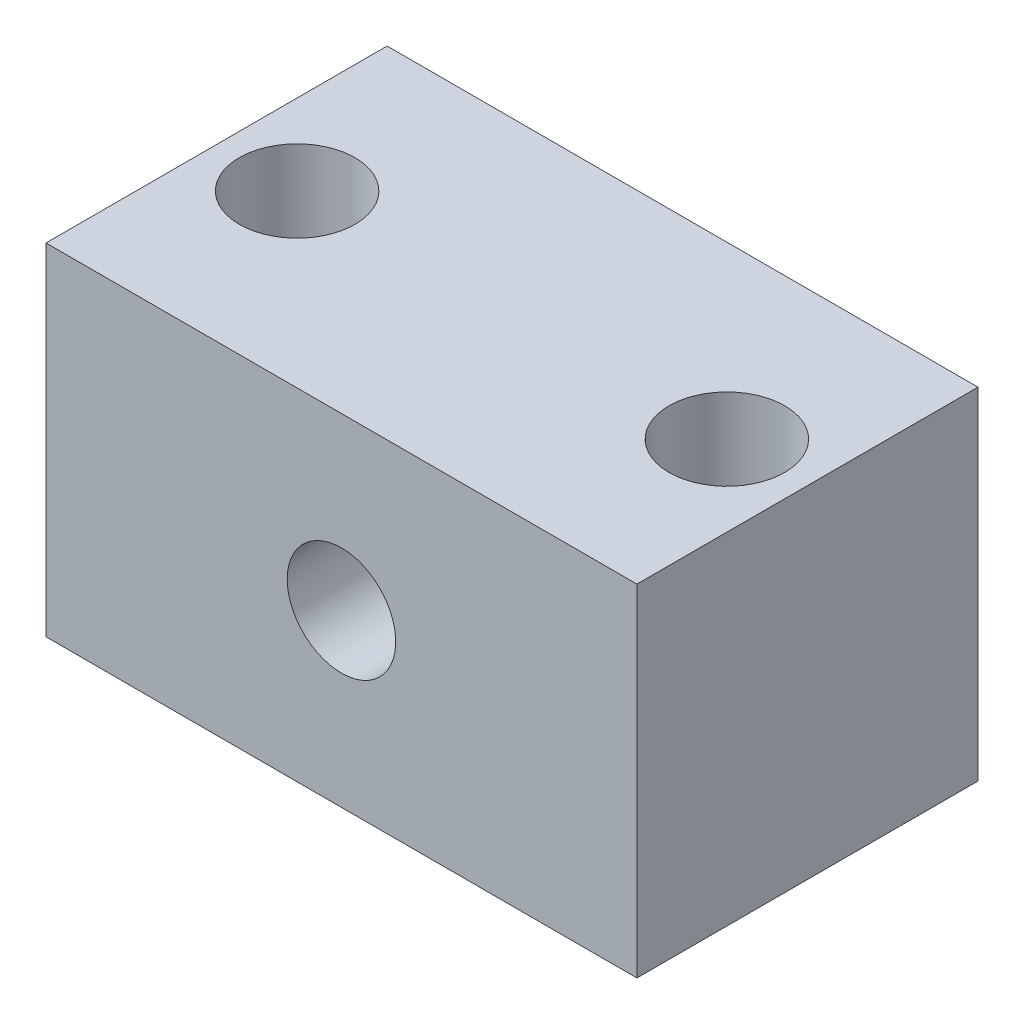
ISO-10303-21;
HEADER;
FILE_DESCRIPTION(('STEP AP214'),'2;1');
FILE_NAME('part.step','',(''),(''),'','','');
FILE_SCHEMA(('AUTOMOTIVE_DESIGN { 1 0 10303 214 1 1 1 1 }'));
ENDSEC;
DATA;
#1=APPLICATION_CONTEXT('core data for automotive mechanical design processes');
#2=APPLICATION_PROTOCOL_DEFINITION('international standard','automotive_design',2000,#1);
#3=PRODUCT_CONTEXT('',#1,'mechanical');
#4=PRODUCT('Part','Part','',(#3));
#5=PRODUCT_RELATED_PRODUCT_CATEGORY('part','',(#4));
#6=PRODUCT_DEFINITION_FORMATION('','',#4);
#7=PRODUCT_DEFINITION_CONTEXT('part definition',#1,'design');
#8=PRODUCT_DEFINITION('design','',#6,#7);
#9=PRODUCT_DEFINITION_SHAPE('','',#8);
#10=(LENGTH_UNIT() NAMED_UNIT(*) SI_UNIT(.MILLI.,.METRE.));
#11=(NAMED_UNIT(*) PLANE_ANGLE_UNIT() SI_UNIT($,.RADIAN.));
#12=(NAMED_UNIT(*) SI_UNIT($,.STERADIAN.) SOLID_ANGLE_UNIT());
#13=UNCERTAINTY_MEASURE_WITH_UNIT(LENGTH_MEASURE(1.E-05),#10,'distance_accuracy_value','');
#14=(GEOMETRIC_REPRESENTATION_CONTEXT(3) GLOBAL_UNCERTAINTY_ASSIGNED_CONTEXT((#13)) GLOBAL_UNIT_ASSIGNED_CONTEXT((#10,
#11,#12)) REPRESENTATION_CONTEXT('',''));
#15=CARTESIAN_POINT('',(0.,0.,0.));
#16=DIRECTION('',(0.,0.,1.));
#17=DIRECTION('',(1.,0.,0.));
#18=AXIS2_PLACEMENT_3D('',#15,#16,#17);
#19=CARTESIAN_POINT('',(0.,6.35,0.));
#20=DIRECTION('',(1.,0.,0.));
#21=DIRECTION('',(0.,0.,-1.));
#22=AXIS2_PLACEMENT_3D('',#19,#20,#21);
#23=PLANE('',#22);
#24=DIRECTION('',(0.,0.,1.));
#25=VECTOR('',#24,1.);
#26=CARTESIAN_POINT('',(0.,-6.35,0.));
#27=LINE('',#26,#25);
#28=CARTESIAN_POINT('',(0.,-6.35,-12.7));
#29=VERTEX_POINT('',#28);
#30=CARTESIAN_POINT('',(0.,-6.35,0.));
#31=VERTEX_POINT('',#30);
#32=EDGE_CURVE('E100',#29,#31,#27,.T.);
#33=ORIENTED_EDGE('',*,*,#32,.T.);
#34=DIRECTION('',(0.,-1.,0.));
#35=VECTOR('',#34,1.);
#36=CARTESIAN_POINT('',(0.,6.35,0.));
#37=LINE('',#36,#35);
#38=CARTESIAN_POINT('',(0.,6.35,0.));
#39=VERTEX_POINT('',#38);
#40=EDGE_CURVE('E11',#39,#31,#37,.T.);
#41=ORIENTED_EDGE('',*,*,#40,.F.);
#42=DIRECTION('',(0.,0.,1.));
#43=VECTOR('',#42,1.);
#44=CARTESIAN_POINT('',(0.,6.35,0.));
#45=LINE('',#44,#43);
#46=CARTESIAN_POINT('',(0.,6.35,-12.7));
#47=VERTEX_POINT('',#46);
#48=EDGE_CURVE('E88',#47,#39,#45,.T.);
#49=ORIENTED_EDGE('',*,*,#48,.F.);
#50=DIRECTION('',(0.,-1.,0.));
#51=VECTOR('',#50,1.);
#52=CARTESIAN_POINT('',(0.,6.35,-12.7));
#53=LINE('',#52,#51);
#54=EDGE_CURVE('E96',#47,#29,#53,.T.);
#55=ORIENTED_EDGE('',*,*,#54,.T.);
#56=EDGE_LOOP('',(#33,#41,#49,#55));
#57=FACE_BOUND('',#56,.T.);
#58=ADVANCED_FACE('F37',(#57),#23,.F.);
#59=CARTESIAN_POINT('',(0.,6.35,0.));
#60=DIRECTION('',(0.,0.,-1.));
#61=DIRECTION('',(-1.,0.,0.));
#62=AXIS2_PLACEMENT_3D('',#59,#60,#61);
#63=PLANE('',#62);
#64=CARTESIAN_POINT('',(11.000000002,0.,0.));
#65=DIRECTION('',(0.,0.,-1.));
#66=DIRECTION('',(-1.,0.,0.));
#67=AXIS2_PLACEMENT_3D('',#64,#65,#66);
#68=CIRCLE('',#67,2.0193);
#69=CARTESIAN_POINT('',(8.98070000200001,0.,0.));
#70=VERTEX_POINT('',#69);
#71=EDGE_CURVE('E125',#70,#70,#68,.T.);
#72=ORIENTED_EDGE('',*,*,#71,.T.);
#73=EDGE_LOOP('',(#72));
#74=FACE_BOUND('',#73,.T.);
#75=DIRECTION('',(1.,0.,0.));
#76=VECTOR('',#75,1.);
#77=CARTESIAN_POINT('',(0.,-6.35,0.));
#78=LINE('',#77,#76);
#79=CARTESIAN_POINT('',(22.000000004,-6.35,0.));
#80=VERTEX_POINT('',#79);
#81=EDGE_CURVE('E92',#31,#80,#78,.T.);
#82=ORIENTED_EDGE('',*,*,#81,.T.);
#83=DIRECTION('',(0.,-1.,0.));
#84=VECTOR('',#83,1.);
#85=CARTESIAN_POINT('',(22.000000004,6.35,0.));
#86=LINE('',#85,#84);
#87=CARTESIAN_POINT('',(22.000000004,6.35,0.));
#88=VERTEX_POINT('',#87);
#89=EDGE_CURVE('E45',#88,#80,#86,.T.);
#90=ORIENTED_EDGE('',*,*,#89,.F.);
#91=DIRECTION('',(1.,0.,0.));
#92=VECTOR('',#91,1.);
#93=CARTESIAN_POINT('',(0.,6.35,0.));
#94=LINE('',#93,#92);
#95=EDGE_CURVE('E83',#39,#88,#94,.T.);
#96=ORIENTED_EDGE('',*,*,#95,.F.);
#97=ORIENTED_EDGE('',*,*,#40,.T.);
#98=EDGE_LOOP('',(#82,#90,#96,#97));
#99=FACE_BOUND('',#98,.T.);
#100=ADVANCED_FACE('F91',(#74,#99),#63,.F.);
#101=CARTESIAN_POINT('',(22.000000004,6.35,0.));
#102=DIRECTION('',(-1.,0.,0.));
#103=DIRECTION('',(0.,0.,1.));
#104=AXIS2_PLACEMENT_3D('',#101,#102,#103);
#105=PLANE('',#104);
#106=DIRECTION('',(0.,0.,-1.));
#107=VECTOR('',#106,1.);
#108=CARTESIAN_POINT('',(22.000000004,-6.35,0.));
#109=LINE('',#108,#107);
#110=CARTESIAN_POINT('',(22.000000004,-6.35,-12.7));
#111=VERTEX_POINT('',#110);
#112=EDGE_CURVE('E70',#80,#111,#109,.T.);
#113=ORIENTED_EDGE('',*,*,#112,.T.);
#114=DIRECTION('',(0.,-1.,0.));
#115=VECTOR('',#114,1.);
#116=CARTESIAN_POINT('',(22.000000004,6.35,-12.7));
#117=LINE('',#116,#115);
#118=CARTESIAN_POINT('',(22.000000004,6.35,-12.7));
#119=VERTEX_POINT('',#118);
#120=EDGE_CURVE('E93',#119,#111,#117,.T.);
#121=ORIENTED_EDGE('',*,*,#120,.F.);
#122=DIRECTION('',(0.,0.,-1.));
#123=VECTOR('',#122,1.);
#124=CARTESIAN_POINT('',(22.000000004,6.35,0.));
#125=LINE('',#124,#123);
#126=EDGE_CURVE('E86',#88,#119,#125,.T.);
#127=ORIENTED_EDGE('',*,*,#126,.F.);
#128=ORIENTED_EDGE('',*,*,#89,.T.);
#129=EDGE_LOOP('',(#113,#121,#127,#128));
#130=FACE_BOUND('',#129,.T.);
#131=ADVANCED_FACE('F94',(#130),#105,.F.);
#132=CARTESIAN_POINT('',(0.,6.35,-12.7));
#133=DIRECTION('',(0.,0.,1.));
#134=DIRECTION('',(1.,0.,0.));
#135=AXIS2_PLACEMENT_3D('',#132,#133,#134);
#136=PLANE('',#135);
#137=CARTESIAN_POINT('',(11.000000002,0.,-12.7));
#138=DIRECTION('',(0.,0.,-1.));
#139=DIRECTION('',(-1.,0.,0.));
#140=AXIS2_PLACEMENT_3D('',#137,#138,#139);
#141=CIRCLE('',#140,2.0193);
#142=CARTESIAN_POINT('',(8.980700002,0.,-12.7));
#143=VERTEX_POINT('',#142);
#144=EDGE_CURVE('E128',#143,#143,#141,.T.);
#145=ORIENTED_EDGE('',*,*,#144,.F.);
#146=EDGE_LOOP('',(#145));
#147=FACE_BOUND('',#146,.T.);
#148=DIRECTION('',(-1.,0.,0.));
#149=VECTOR('',#148,1.);
#150=CARTESIAN_POINT('',(0.,-6.35,-12.7));
#151=LINE('',#150,#149);
#152=EDGE_CURVE('E76',#111,#29,#151,.T.);
#153=ORIENTED_EDGE('',*,*,#152,.T.);
#154=ORIENTED_EDGE('',*,*,#54,.F.);
#155=DIRECTION('',(-1.,0.,0.));
#156=VECTOR('',#155,1.);
#157=CARTESIAN_POINT('',(0.,6.35,-12.7));
#158=LINE('',#157,#156);
#159=EDGE_CURVE('E53',#119,#47,#158,.T.);
#160=ORIENTED_EDGE('',*,*,#159,.F.);
#161=ORIENTED_EDGE('',*,*,#120,.T.);
#162=EDGE_LOOP('',(#153,#154,#160,#161));
#163=FACE_BOUND('',#162,.T.);
#164=ADVANCED_FACE('F108',(#147,#163),#136,.F.);
#165=CARTESIAN_POINT('',(0.,6.35,0.));
#166=DIRECTION('',(0.,-1.,0.));
#167=DIRECTION('',(0.,0.,-1.));
#168=AXIS2_PLACEMENT_3D('',#165,#166,#167);
#169=PLANE('',#168);
#170=CARTESIAN_POINT('',(19.000000004,6.35,-6.35));
#171=DIRECTION('',(0.,1.,0.));
#172=DIRECTION('',(0.,0.,1.));
#173=AXIS2_PLACEMENT_3D('',#170,#171,#172);
#174=CIRCLE('',#173,2.15265);
#175=CARTESIAN_POINT('',(19.000000004,6.35,-4.19735));
#176=VERTEX_POINT('',#175);
#177=EDGE_CURVE('E122',#176,#176,#174,.T.);
#178=ORIENTED_EDGE('',*,*,#177,.F.);
#179=EDGE_LOOP('',(#178));
#180=FACE_BOUND('',#179,.T.);
#181=CARTESIAN_POINT('',(3.,6.35,-6.35));
#182=DIRECTION('',(0.,1.,0.));
#183=DIRECTION('',(0.,0.,1.));
#184=AXIS2_PLACEMENT_3D('',#181,#182,#183);
#185=CIRCLE('',#184,2.15265);
#186=CARTESIAN_POINT('',(3.,6.35,-4.19735));
#187=VERTEX_POINT('',#186);
#188=EDGE_CURVE('E116',#187,#187,#185,.T.);
#189=ORIENTED_EDGE('',*,*,#188,.F.);
#190=EDGE_LOOP('',(#189));
#191=FACE_BOUND('',#190,.T.);
#192=ORIENTED_EDGE('',*,*,#48,.T.);
#193=ORIENTED_EDGE('',*,*,#95,.T.);
#194=ORIENTED_EDGE('',*,*,#126,.T.);
#195=ORIENTED_EDGE('',*,*,#159,.T.);
#196=EDGE_LOOP('',(#192,#193,#194,#195));
#197=FACE_BOUND('',#196,.T.);
#198=ADVANCED_FACE('F84',(#180,#191,#197),#169,.F.);
#199=CARTESIAN_POINT('',(0.,-6.35,0.));
#200=DIRECTION('',(0.,-1.,0.));
#201=DIRECTION('',(0.,0.,-1.));
#202=AXIS2_PLACEMENT_3D('',#199,#200,#201);
#203=PLANE('',#202);
#204=CARTESIAN_POINT('',(19.000000004,-6.35,-6.35));
#205=DIRECTION('',(0.,1.,0.));
#206=DIRECTION('',(0.,0.,1.));
#207=AXIS2_PLACEMENT_3D('',#204,#205,#206);
#208=CIRCLE('',#207,2.15265);
#209=CARTESIAN_POINT('',(19.000000004,-6.35,-4.19735));
#210=VERTEX_POINT('',#209);
#211=EDGE_CURVE('E119',#210,#210,#208,.T.);
#212=ORIENTED_EDGE('',*,*,#211,.T.);
#213=EDGE_LOOP('',(#212));
#214=FACE_BOUND('',#213,.T.);
#215=CARTESIAN_POINT('',(3.,-6.35,-6.35));
#216=DIRECTION('',(0.,1.,0.));
#217=DIRECTION('',(0.,0.,1.));
#218=AXIS2_PLACEMENT_3D('',#215,#216,#217);
#219=CIRCLE('',#218,2.15265);
#220=CARTESIAN_POINT('',(3.,-6.35,-4.19735));
#221=VERTEX_POINT('',#220);
#222=EDGE_CURVE('E103',#221,#221,#219,.T.);
#223=ORIENTED_EDGE('',*,*,#222,.T.);
#224=EDGE_LOOP('',(#223));
#225=FACE_BOUND('',#224,.T.);
#226=ORIENTED_EDGE('',*,*,#32,.F.);
#227=ORIENTED_EDGE('',*,*,#152,.F.);
#228=ORIENTED_EDGE('',*,*,#112,.F.);
#229=ORIENTED_EDGE('',*,*,#81,.F.);
#230=EDGE_LOOP('',(#226,#227,#228,#229));
#231=FACE_BOUND('',#230,.T.);
#232=ADVANCED_FACE('F111',(#214,#225,#231),#203,.T.);
#233=CARTESIAN_POINT('',(3.,6.35,-6.35));
#234=DIRECTION('',(0.,1.,0.));
#235=DIRECTION('',(0.,0.,1.));
#236=AXIS2_PLACEMENT_3D('',#233,#234,#235);
#237=CYLINDRICAL_SURFACE('',#236,2.15265);
#238=ORIENTED_EDGE('',*,*,#222,.F.);
#239=EDGE_LOOP('',(#238));
#240=FACE_BOUND('',#239,.T.);
#241=ORIENTED_EDGE('',*,*,#188,.T.);
#242=EDGE_LOOP('',(#241));
#243=FACE_BOUND('',#242,.T.);
#244=ADVANCED_FACE('F159',(#240,#243),#237,.F.);
#245=CARTESIAN_POINT('',(19.000000004,6.35,-6.35));
#246=DIRECTION('',(0.,1.,0.));
#247=DIRECTION('',(0.,0.,1.));
#248=AXIS2_PLACEMENT_3D('',#245,#246,#247);
#249=CYLINDRICAL_SURFACE('',#248,2.15265);
#250=ORIENTED_EDGE('',*,*,#211,.F.);
#251=EDGE_LOOP('',(#250));
#252=FACE_BOUND('',#251,.T.);
#253=ORIENTED_EDGE('',*,*,#177,.T.);
#254=EDGE_LOOP('',(#253));
#255=FACE_BOUND('',#254,.T.);
#256=ADVANCED_FACE('F154',(#252,#255),#249,.F.);
#257=CARTESIAN_POINT('',(11.000000002,0.,-12.7));
#258=DIRECTION('',(0.,0.,-1.));
#259=DIRECTION('',(-1.,0.,0.));
#260=AXIS2_PLACEMENT_3D('',#257,#258,#259);
#261=CYLINDRICAL_SURFACE('',#260,2.0193);
#262=ORIENTED_EDGE('',*,*,#71,.F.);
#263=EDGE_LOOP('',(#262));
#264=FACE_BOUND('',#263,.T.);
#265=ORIENTED_EDGE('',*,*,#144,.T.);
#266=EDGE_LOOP('',(#265));
#267=FACE_BOUND('',#266,.T.);
#268=ADVANCED_FACE('F132',(#264,#267),#261,.F.);
#269=CLOSED_SHELL('',(#58,#100,#131,#164,#198,#232,#244,#256,#268));
#270=MANIFOLD_SOLID_BREP('B2',#269);
#271=ADVANCED_BREP_SHAPE_REPRESENTATION('',(#18,#270),#14);
#272=SHAPE_DEFINITION_REPRESENTATION(#9,#271);
ENDSEC;
END-ISO-10303-21;
